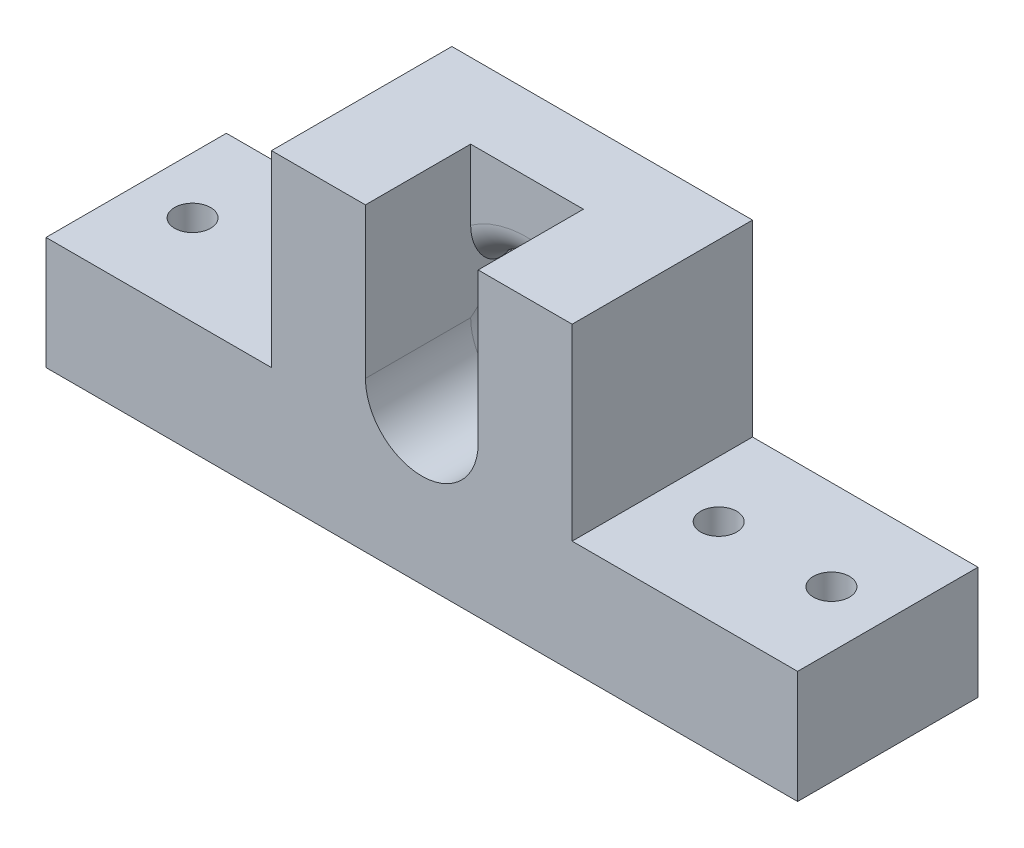
ISO-10303-21;
HEADER;
FILE_DESCRIPTION(('STEP AP214'),'2;1');
FILE_NAME('part.step','',(''),(''),'','','');
FILE_SCHEMA(('AUTOMOTIVE_DESIGN { 1 0 10303 214 1 1 1 1 }'));
ENDSEC;
DATA;
#1=APPLICATION_CONTEXT('core data for automotive mechanical design processes');
#2=APPLICATION_PROTOCOL_DEFINITION('international standard','automotive_design',2000,#1);
#3=PRODUCT_CONTEXT('',#1,'mechanical');
#4=PRODUCT('Part','Part','',(#3));
#5=PRODUCT_RELATED_PRODUCT_CATEGORY('part','',(#4));
#6=PRODUCT_DEFINITION_FORMATION('','',#4);
#7=PRODUCT_DEFINITION_CONTEXT('part definition',#1,'design');
#8=PRODUCT_DEFINITION('design','',#6,#7);
#9=PRODUCT_DEFINITION_SHAPE('','',#8);
#10=(LENGTH_UNIT() NAMED_UNIT(*) SI_UNIT(.MILLI.,.METRE.));
#11=(NAMED_UNIT(*) PLANE_ANGLE_UNIT() SI_UNIT($,.RADIAN.));
#12=(NAMED_UNIT(*) SI_UNIT($,.STERADIAN.) SOLID_ANGLE_UNIT());
#13=UNCERTAINTY_MEASURE_WITH_UNIT(LENGTH_MEASURE(1.E-05),#10,'distance_accuracy_value','');
#14=(GEOMETRIC_REPRESENTATION_CONTEXT(3) GLOBAL_UNCERTAINTY_ASSIGNED_CONTEXT((#13)) GLOBAL_UNIT_ASSIGNED_CONTEXT((#10,
#11,#12)) REPRESENTATION_CONTEXT('',''));
#15=CARTESIAN_POINT('',(0.,0.,0.));
#16=DIRECTION('',(0.,0.,1.));
#17=DIRECTION('',(1.,0.,0.));
#18=AXIS2_PLACEMENT_3D('',#15,#16,#17);
#19=CARTESIAN_POINT('',(0.,0.,3.));
#20=DIRECTION('',(0.,0.,-1.));
#21=DIRECTION('',(-1.,0.,0.));
#22=AXIS2_PLACEMENT_3D('',#19,#20,#21);
#23=TOROIDAL_SURFACE('',#22,6.51393202250021,2.);
#24=CARTESIAN_POINT('',(0.,0.,5.));
#25=DIRECTION('',(0.,0.,1.));
#26=DIRECTION('',(1.,0.,0.));
#27=AXIS2_PLACEMENT_3D('',#24,#25,#26);
#28=CIRCLE('',#27,6.51393202250021);
#29=CARTESIAN_POINT('',(-3.75,5.32623792124926,5.));
#30=VERTEX_POINT('',#29);
#31=CARTESIAN_POINT('',(3.75,5.32623792124926,5.));
#32=VERTEX_POINT('',#31);
#33=EDGE_CURVE('E248',#30,#32,#28,.F.);
#34=ORIENTED_EDGE('',*,*,#33,.F.);
#35=CARTESIAN_POINT('',(-3.75,5.32623792124926,5.));
#36=CARTESIAN_POINT('',(-3.75,5.24142075305049,4.99999589275912));
#37=CARTESIAN_POINT('',(-3.75,5.15665584859394,4.996393060593));
#38=CARTESIAN_POINT('',(-3.75,4.98774697404806,4.98232777876594));
#39=CARTESIAN_POINT('',(-3.75,4.90360264574141,4.97186966106574));
#40=CARTESIAN_POINT('',(-3.75,4.65274389859945,4.93071637865047));
#41=CARTESIAN_POINT('',(-3.75,4.48757234833523,4.89024203738008));
#42=CARTESIAN_POINT('',(-3.75,4.15320531995224,4.78184843346914));
#43=CARTESIAN_POINT('',(-3.75,3.98458646643673,4.71215196628134));
#44=CARTESIAN_POINT('',(-3.75,3.74139729987364,4.58868198549796));
#45=CARTESIAN_POINT('',(-3.75,3.66191812480479,4.54434275404163));
#46=CARTESIAN_POINT('',(-3.75,3.50682196432229,4.4493783283302));
#47=CARTESIAN_POINT('',(-3.75,3.43120357558848,4.39875544135044));
#48=CARTESIAN_POINT('',(-3.75,3.25997785602826,4.27305740879634));
#49=CARTESIAN_POINT('',(-3.75,3.16618499187349,4.19547948351475));
#50=CARTESIAN_POINT('',(-3.75,2.98997837199384,4.02832952085482));
#51=CARTESIAN_POINT('',(-3.75,2.90754430834929,3.93877946810826));
#52=CARTESIAN_POINT('',(-3.75,2.78260024439482,3.77663176413565));
#53=CARTESIAN_POINT('',(-3.75,2.73566181799742,3.70747366959804));
#54=CARTESIAN_POINT('',(-3.75,2.65267693131445,3.56286453836619));
#55=CARTESIAN_POINT('',(-3.75,2.61661134332685,3.48742485439183));
#56=CARTESIAN_POINT('',(-3.75,2.56505292043284,3.3473269582184));
#57=CARTESIAN_POINT('',(-3.75,2.54684324776595,3.28368282276986));
#58=CARTESIAN_POINT('',(-3.75,2.52139690051183,3.1542466754707));
#59=CARTESIAN_POINT('',(-3.75,2.51414683623527,3.0884573850243));
#60=CARTESIAN_POINT('',(-3.75,2.51147563157978,2.95645123111973));
#61=CARTESIAN_POINT('',(-3.75,2.51608675069872,2.89023369121582));
#62=CARTESIAN_POINT('',(-3.75,2.53661817693441,2.75960711691154));
#63=CARTESIAN_POINT('',(-3.75,2.55254407950708,2.69519899370393));
#64=CARTESIAN_POINT('',(-3.75,2.59993234790015,2.5517862186649));
#65=CARTESIAN_POINT('',(-3.75,2.63452237528982,2.47383046359681));
#66=CARTESIAN_POINT('',(-3.75,2.71573980506262,2.32403383978969));
#67=CARTESIAN_POINT('',(-3.75,2.76244442555167,2.25223628016114));
#68=CARTESIAN_POINT('',(-3.75,2.85436040261289,2.12885841605535));
#69=CARTESIAN_POINT('',(-3.75,2.89802160113365,2.07609704247627));
#70=CARTESIAN_POINT('',(-3.75,2.98981868429598,1.97452836625829));
#71=CARTESIAN_POINT('',(-3.75,3.03795983314878,1.92572584476509));
#72=CARTESIAN_POINT('',(-3.75,3.13676832766109,1.83293898188836));
#73=CARTESIAN_POINT('',(-3.75,3.18736163841635,1.78887513028478));
#74=CARTESIAN_POINT('',(-3.75,3.2912901974201,1.70441609670762));
#75=CARTESIAN_POINT('',(-3.75,3.34461723876659,1.66401083787398));
#76=CARTESIAN_POINT('',(-3.75,3.39911632203731,1.62530589386354));
#77=B_SPLINE_CURVE_WITH_KNOTS('',3,(#35,#36,#37,#38,#39,#40,#41,#42,#43,#44,#45,#46,#47,#48,#49,
#50,#51,#52,#53,#54,#55,#56,#57,#58,#59,#60,#61,#62,#63,#64,#65,#66,#67,#68,#69,#70,#71,#72,#73,
#74,#75,#76),.UNSPECIFIED.,.F.,.F.,(4,2,2,2,2,2,2,2,2,2,2,2,2,2,2,2,2,2,2,2,4),(0.,
0.254285952569605,0.50841137262712,1.01656918063696,1.56157292830256,1.83436241062647,
2.10705202292391,2.471309920665,2.834907884414,3.08495551445269,3.3345606540104,
3.53233526624986,3.72986805534574,3.92793865267557,4.12610726932957,4.38055044885354,
4.63665709693599,4.84183197365397,5.04725106308665,5.24836744503832,5.44891187748436),.UNSPECIFIED.);
#78=CARTESIAN_POINT('',(-3.75,3.34219083015094,1.66666666666666));
#79=VERTEX_POINT('',#78);
#80=EDGE_CURVE('E49',#30,#79,#77,.T.);
#81=ORIENTED_EDGE('',*,*,#80,.T.);
#82=CARTESIAN_POINT('',(0.,0.,1.66666666666667));
#83=DIRECTION('',(0.,0.,1.));
#84=DIRECTION('',(1.,0.,0.));
#85=AXIS2_PLACEMENT_3D('',#82,#83,#84);
#86=CIRCLE('',#85,5.02322003750035);
#87=CARTESIAN_POINT('',(2.89181328198696,4.107329483651,1.66666666666667));
#88=VERTEX_POINT('',#87);
#89=EDGE_CURVE('E60',#88,#79,#86,.T.);
#90=ORIENTED_EDGE('',*,*,#89,.F.);
#91=CARTESIAN_POINT('',(0.,0.,1.66666666666667));
#92=DIRECTION('',(0.,0.,1.));
#93=DIRECTION('',(1.,0.,0.));
#94=AXIS2_PLACEMENT_3D('',#91,#92,#93);
#95=CIRCLE('',#94,5.02322003750035);
#96=CARTESIAN_POINT('',(3.75,3.34219083015094,1.66666666666666));
#97=VERTEX_POINT('',#96);
#98=EDGE_CURVE('E276',#97,#88,#95,.T.);
#99=ORIENTED_EDGE('',*,*,#98,.F.);
#100=CARTESIAN_POINT('',(3.75,5.32623792124926,5.));
#101=CARTESIAN_POINT('',(3.75,5.24142075305049,4.99999589275912));
#102=CARTESIAN_POINT('',(3.75,5.15665584859394,4.996393060593));
#103=CARTESIAN_POINT('',(3.75,4.98774697404806,4.98232777876594));
#104=CARTESIAN_POINT('',(3.75,4.90360264574141,4.97186966106574));
#105=CARTESIAN_POINT('',(3.75,4.65274389859945,4.93071637865047));
#106=CARTESIAN_POINT('',(3.75,4.48757234833523,4.89024203738008));
#107=CARTESIAN_POINT('',(3.75,4.15320531995224,4.78184843346914));
#108=CARTESIAN_POINT('',(3.75,3.98458646643673,4.71215196628134));
#109=CARTESIAN_POINT('',(3.75,3.74139729987364,4.58868198549796));
#110=CARTESIAN_POINT('',(3.75,3.66191812480479,4.54434275404163));
#111=CARTESIAN_POINT('',(3.75,3.50682196432229,4.4493783283302));
#112=CARTESIAN_POINT('',(3.75,3.43120357558848,4.39875544135044));
#113=CARTESIAN_POINT('',(3.75,3.25997785602826,4.27305740879634));
#114=CARTESIAN_POINT('',(3.75,3.16618499187349,4.19547948351475));
#115=CARTESIAN_POINT('',(3.75,2.98997837199384,4.02832952085482));
#116=CARTESIAN_POINT('',(3.75,2.90754430834929,3.93877946810826));
#117=CARTESIAN_POINT('',(3.75,2.78260024439482,3.77663176413565));
#118=CARTESIAN_POINT('',(3.75,2.73566181799742,3.70747366959804));
#119=CARTESIAN_POINT('',(3.75,2.65267693131445,3.56286453836619));
#120=CARTESIAN_POINT('',(3.75,2.61661134332685,3.48742485439183));
#121=CARTESIAN_POINT('',(3.75,2.56505292043284,3.3473269582184));
#122=CARTESIAN_POINT('',(3.75,2.54684324776595,3.28368282276986));
#123=CARTESIAN_POINT('',(3.75,2.52139690051183,3.1542466754707));
#124=CARTESIAN_POINT('',(3.75,2.51414683623527,3.0884573850243));
#125=CARTESIAN_POINT('',(3.75,2.51147563157978,2.95645123111973));
#126=CARTESIAN_POINT('',(3.75,2.51608675069872,2.89023369121582));
#127=CARTESIAN_POINT('',(3.75,2.53661817693441,2.75960711691154));
#128=CARTESIAN_POINT('',(3.75,2.55254407950708,2.69519899370393));
#129=CARTESIAN_POINT('',(3.75,2.59993234790015,2.5517862186649));
#130=CARTESIAN_POINT('',(3.75,2.63452237528982,2.47383046359681));
#131=CARTESIAN_POINT('',(3.75,2.71573980506262,2.32403383978969));
#132=CARTESIAN_POINT('',(3.75,2.76244442555167,2.25223628016114));
#133=CARTESIAN_POINT('',(3.75,2.85436040261289,2.12885841605535));
#134=CARTESIAN_POINT('',(3.75,2.89802160113365,2.07609704247627));
#135=CARTESIAN_POINT('',(3.75,2.98981868429598,1.97452836625829));
#136=CARTESIAN_POINT('',(3.75,3.03795983314878,1.92572584476509));
#137=CARTESIAN_POINT('',(3.75,3.13676832766109,1.83293898188836));
#138=CARTESIAN_POINT('',(3.75,3.18736163841635,1.78887513028478));
#139=CARTESIAN_POINT('',(3.75,3.2912901974201,1.70441609670762));
#140=CARTESIAN_POINT('',(3.75,3.34461723876659,1.66401083787398));
#141=CARTESIAN_POINT('',(3.75,3.39911632203731,1.62530589386354));
#142=B_SPLINE_CURVE_WITH_KNOTS('',3,(#100,#101,#102,#103,#104,#105,#106,#107,#108,#109,#110,
#111,#112,#113,#114,#115,#116,#117,#118,#119,#120,#121,#122,#123,#124,#125,#126,#127,#128,#129,
#130,#131,#132,#133,#134,#135,#136,#137,#138,#139,#140,#141),.UNSPECIFIED.,.F.,.F.,(4,2,2,2,2,2,
2,2,2,2,2,2,2,2,2,2,2,2,2,2,4),(0.,0.254285952569605,0.50841137262712,1.01656918063696,
1.56157292830256,1.83436241062647,2.10705202292391,2.471309920665,2.834907884414,
3.08495551445269,3.3345606540104,3.53233526624986,3.72986805534574,3.92793865267557,
4.12610726932957,4.38055044885354,4.63665709693599,4.84183197365397,5.04725106308665,
5.24836744503832,5.44891187748436),.UNSPECIFIED.);
#143=EDGE_CURVE('E11',#97,#32,#142,.F.);
#144=ORIENTED_EDGE('',*,*,#143,.T.);
#145=EDGE_LOOP('',(#34,#81,#90,#99,#144));
#146=FACE_BOUND('',#145,.T.);
#147=ADVANCED_FACE('F36',(#146),#23,.T.);
#148=CARTESIAN_POINT('',(10.,-10.,12.));
#149=DIRECTION('',(-1.,0.,0.));
#150=DIRECTION('',(0.,0.,1.));
#151=AXIS2_PLACEMENT_3D('',#148,#149,#150);
#152=PLANE('',#151);
#153=DIRECTION('',(0.,0.,1.));
#154=VECTOR('',#153,1.);
#155=CARTESIAN_POINT('',(10.,-2.50000000000003,0.));
#156=LINE('',#155,#154);
#157=CARTESIAN_POINT('',(10.,-2.50000000000003,0.));
#158=VERTEX_POINT('',#157);
#159=CARTESIAN_POINT('',(10.,-2.50000000000003,12.));
#160=VERTEX_POINT('',#159);
#161=EDGE_CURVE('E191',#158,#160,#156,.T.);
#162=ORIENTED_EDGE('',*,*,#161,.F.);
#163=DIRECTION('',(0.,1.,0.));
#164=VECTOR('',#163,1.);
#165=CARTESIAN_POINT('',(10.,-10.,0.));
#166=LINE('',#165,#164);
#167=CARTESIAN_POINT('',(10.,10.,0.));
#168=VERTEX_POINT('',#167);
#169=EDGE_CURVE('E221',#158,#168,#166,.T.);
#170=ORIENTED_EDGE('',*,*,#169,.T.);
#171=DIRECTION('',(0.,0.,-1.));
#172=VECTOR('',#171,1.);
#173=CARTESIAN_POINT('',(10.,10.,12.));
#174=LINE('',#173,#172);
#175=CARTESIAN_POINT('',(10.,10.,12.));
#176=VERTEX_POINT('',#175);
#177=EDGE_CURVE('E239',#176,#168,#174,.T.);
#178=ORIENTED_EDGE('',*,*,#177,.F.);
#179=DIRECTION('',(0.,1.,0.));
#180=VECTOR('',#179,1.);
#181=CARTESIAN_POINT('',(10.,-10.,12.));
#182=LINE('',#181,#180);
#183=EDGE_CURVE('E222',#160,#176,#182,.T.);
#184=ORIENTED_EDGE('',*,*,#183,.F.);
#185=EDGE_LOOP('',(#162,#170,#178,#184));
#186=FACE_BOUND('',#185,.T.);
#187=ADVANCED_FACE('F312',(#186),#152,.F.);
#188=CARTESIAN_POINT('',(0.,0.,5.));
#189=DIRECTION('',(0.,0.,-1.));
#190=DIRECTION('',(-1.,0.,0.));
#191=AXIS2_PLACEMENT_3D('',#188,#189,#190);
#192=TOROIDAL_SURFACE('',#191,8.75,5.);
#193=CARTESIAN_POINT('',(0.,0.,0.));
#194=DIRECTION('',(0.,0.,-1.));
#195=DIRECTION('',(-1.,0.,0.));
#196=AXIS2_PLACEMENT_3D('',#193,#194,#195);
#197=CIRCLE('',#196,8.75);
#198=CARTESIAN_POINT('',(-8.75,0.,0.));
#199=VERTEX_POINT('',#198);
#200=EDGE_CURVE('E242',#199,#199,#197,.F.);
#201=ORIENTED_EDGE('',*,*,#200,.F.);
#202=EDGE_LOOP('',(#201));
#203=FACE_BOUND('',#202,.T.);
#204=ORIENTED_EDGE('',*,*,#89,.T.);
#205=CARTESIAN_POINT('',(-3.75,3.34219083015094,1.66666666666666));
#206=CARTESIAN_POINT('',(-3.75,3.18375045831794,1.78452059336337));
#207=CARTESIAN_POINT('',(-3.75,3.02852785496756,1.90657516122958));
#208=CARTESIAN_POINT('',(-3.75,2.72411204642601,2.15778019919901));
#209=CARTESIAN_POINT('',(-3.75,2.57491452549424,2.28692542801372));
#210=CARTESIAN_POINT('',(-3.75,2.1364308000886,2.68239162266341));
#211=CARTESIAN_POINT('',(-3.75,1.85516015486667,2.95757880115431));
#212=CARTESIAN_POINT('',(-3.75,1.30915338146643,3.52188548354713));
#213=CARTESIAN_POINT('',(-3.75,1.04436841247005,3.81095884920809));
#214=CARTESIAN_POINT('',(-3.75,0.522785560624921,4.39644353846854));
#215=CARTESIAN_POINT('',(-3.74999999999999,0.265992725728618,4.69285929559331));
#216=CARTESIAN_POINT('',(-3.75,0.00617213260276022,4.99287303469035));
#217=CARTESIAN_POINT('',(-3.75,0.00308606558016268,4.99643651793387));
#218=CARTESIAN_POINT('',(-3.75,0.,5.));
#219=B_SPLINE_CURVE_WITH_KNOTS('',3,(#205,#206,#207,#208,#209,#210,#211,#212,#213,#214,#215,
#216,#217,#218),.UNSPECIFIED.,.F.,.F.,(4,2,2,2,2,2,4),(0.,0.592215527133382,1.18399904329588,
2.36345221215954,3.53922619531928,4.71572833479174,4.72987047041556),.UNSPECIFIED.);
#220=CARTESIAN_POINT('',(-3.75,0.,5.));
#221=VERTEX_POINT('',#220);
#222=EDGE_CURVE('E425',#79,#221,#219,.T.);
#223=ORIENTED_EDGE('',*,*,#222,.T.);
#224=CARTESIAN_POINT('',(0.,0.,5.));
#225=DIRECTION('',(0.,0.,-1.));
#226=DIRECTION('',(-1.,0.,0.));
#227=AXIS2_PLACEMENT_3D('',#224,#225,#226);
#228=CIRCLE('',#227,3.75);
#229=CARTESIAN_POINT('',(3.75,0.,5.));
#230=VERTEX_POINT('',#229);
#231=EDGE_CURVE('E245',#230,#221,#228,.T.);
#232=ORIENTED_EDGE('',*,*,#231,.F.);
#233=CARTESIAN_POINT('',(3.75,3.34219083015094,1.66666666666666));
#234=CARTESIAN_POINT('',(3.75,3.18375045831794,1.78452059336337));
#235=CARTESIAN_POINT('',(3.75,3.02852785496756,1.90657516122958));
#236=CARTESIAN_POINT('',(3.75,2.72411204642601,2.15778019919901));
#237=CARTESIAN_POINT('',(3.75,2.57491452549424,2.28692542801372));
#238=CARTESIAN_POINT('',(3.75,2.1364308000886,2.68239162266341));
#239=CARTESIAN_POINT('',(3.75,1.85516015486667,2.95757880115431));
#240=CARTESIAN_POINT('',(3.75,1.30915338146643,3.52188548354713));
#241=CARTESIAN_POINT('',(3.75,1.04436841247005,3.81095884920809));
#242=CARTESIAN_POINT('',(3.75,0.522785560624921,4.39644353846854));
#243=CARTESIAN_POINT('',(3.74999999999999,0.265992725728618,4.69285929559331));
#244=CARTESIAN_POINT('',(3.75,0.00617213260276022,4.99287303469035));
#245=CARTESIAN_POINT('',(3.75,0.00308606558016268,4.99643651793387));
#246=CARTESIAN_POINT('',(3.75,0.,5.));
#247=B_SPLINE_CURVE_WITH_KNOTS('',3,(#233,#234,#235,#236,#237,#238,#239,#240,#241,#242,#243,
#244,#245,#246),.UNSPECIFIED.,.F.,.F.,(4,2,2,2,2,2,4),(0.,0.592215527133382,1.18399904329588,
2.36345221215954,3.53922619531928,4.71572833479174,4.72987047041556),.UNSPECIFIED.);
#248=EDGE_CURVE('E269',#230,#97,#247,.F.);
#249=ORIENTED_EDGE('',*,*,#248,.T.);
#250=ORIENTED_EDGE('',*,*,#98,.T.);
#251=EDGE_LOOP('',(#204,#223,#232,#249,#250));
#252=FACE_BOUND('',#251,.T.);
#253=ADVANCED_FACE('F278',(#203,#252),#192,.T.);
#254=CARTESIAN_POINT('',(0.,0.,12.));
#255=DIRECTION('',(0.,0.,-1.));
#256=DIRECTION('',(-1.,0.,0.));
#257=AXIS2_PLACEMENT_3D('',#254,#255,#256);
#258=PLANE('',#257);
#259=CARTESIAN_POINT('',(0.,0.,12.));
#260=DIRECTION('',(0.,0.,1.));
#261=DIRECTION('',(1.,0.,0.));
#262=AXIS2_PLACEMENT_3D('',#259,#260,#261);
#263=CIRCLE('',#262,3.75);
#264=CARTESIAN_POINT('',(-3.75,0.,12.));
#265=VERTEX_POINT('',#264);
#266=CARTESIAN_POINT('',(3.75,0.,12.));
#267=VERTEX_POINT('',#266);
#268=EDGE_CURVE('E212',#265,#267,#263,.T.);
#269=ORIENTED_EDGE('',*,*,#268,.F.);
#270=DIRECTION('',(0.,-1.,0.));
#271=VECTOR('',#270,1.);
#272=CARTESIAN_POINT('',(-3.75,0.,12.));
#273=LINE('',#272,#271);
#274=CARTESIAN_POINT('',(-3.75,10.,12.));
#275=VERTEX_POINT('',#274);
#276=EDGE_CURVE('E201',#275,#265,#273,.T.);
#277=ORIENTED_EDGE('',*,*,#276,.F.);
#278=DIRECTION('',(-1.,0.,0.));
#279=VECTOR('',#278,1.);
#280=CARTESIAN_POINT('',(-10.,10.,12.));
#281=LINE('',#280,#279);
#282=CARTESIAN_POINT('',(-10.,10.,12.));
#283=VERTEX_POINT('',#282);
#284=EDGE_CURVE('E224',#275,#283,#281,.T.);
#285=ORIENTED_EDGE('',*,*,#284,.T.);
#286=DIRECTION('',(0.,-1.,0.));
#287=VECTOR('',#286,1.);
#288=CARTESIAN_POINT('',(-10.,-10.,12.));
#289=LINE('',#288,#287);
#290=CARTESIAN_POINT('',(-10.,-2.50000000000004,12.));
#291=VERTEX_POINT('',#290);
#292=EDGE_CURVE('E155',#283,#291,#289,.T.);
#293=ORIENTED_EDGE('',*,*,#292,.T.);
#294=DIRECTION('',(-1.,0.,0.));
#295=VECTOR('',#294,1.);
#296=CARTESIAN_POINT('',(-25.,-2.50000000000004,12.));
#297=LINE('',#296,#295);
#298=CARTESIAN_POINT('',(-25.,-2.50000000000004,12.));
#299=VERTEX_POINT('',#298);
#300=EDGE_CURVE('E170',#291,#299,#297,.T.);
#301=ORIENTED_EDGE('',*,*,#300,.T.);
#302=DIRECTION('',(0.,-1.,0.));
#303=VECTOR('',#302,1.);
#304=CARTESIAN_POINT('',(-25.,-10.,12.));
#305=LINE('',#304,#303);
#306=CARTESIAN_POINT('',(-25.,-10.,12.));
#307=VERTEX_POINT('',#306);
#308=EDGE_CURVE('E160',#299,#307,#305,.T.);
#309=ORIENTED_EDGE('',*,*,#308,.T.);
#310=DIRECTION('',(1.,0.,0.));
#311=VECTOR('',#310,1.);
#312=CARTESIAN_POINT('',(-10.,-10.,12.));
#313=LINE('',#312,#311);
#314=CARTESIAN_POINT('',(25.0000000000001,-10.,12.));
#315=VERTEX_POINT('',#314);
#316=EDGE_CURVE('E143',#307,#315,#313,.T.);
#317=ORIENTED_EDGE('',*,*,#316,.T.);
#318=DIRECTION('',(0.,1.,0.));
#319=VECTOR('',#318,1.);
#320=CARTESIAN_POINT('',(25.0000000000001,-10.,12.));
#321=LINE('',#320,#319);
#322=CARTESIAN_POINT('',(25.,-2.50000000000003,12.));
#323=VERTEX_POINT('',#322);
#324=EDGE_CURVE('E173',#315,#323,#321,.T.);
#325=ORIENTED_EDGE('',*,*,#324,.T.);
#326=DIRECTION('',(-1.,0.,0.));
#327=VECTOR('',#326,1.);
#328=CARTESIAN_POINT('',(25.,-2.50000000000003,12.));
#329=LINE('',#328,#327);
#330=EDGE_CURVE('E185',#323,#160,#329,.T.);
#331=ORIENTED_EDGE('',*,*,#330,.T.);
#332=ORIENTED_EDGE('',*,*,#183,.T.);
#333=CARTESIAN_POINT('',(3.75,10.,12.));
#334=VERTEX_POINT('',#333);
#335=EDGE_CURVE('E226',#176,#334,#281,.T.);
#336=ORIENTED_EDGE('',*,*,#335,.T.);
#337=DIRECTION('',(0.,1.,0.));
#338=VECTOR('',#337,1.);
#339=CARTESIAN_POINT('',(3.75,0.,12.));
#340=LINE('',#339,#338);
#341=EDGE_CURVE('E194',#267,#334,#340,.T.);
#342=ORIENTED_EDGE('',*,*,#341,.F.);
#343=EDGE_LOOP('',(#269,#277,#285,#293,#301,#309,#317,#325,#331,#332,#336,#342));
#344=FACE_BOUND('',#343,.T.);
#345=ADVANCED_FACE('F168',(#344),#258,.F.);
#346=CARTESIAN_POINT('',(0.,0.,0.));
#347=DIRECTION('',(0.,0.,-1.));
#348=DIRECTION('',(-1.,0.,0.));
#349=AXIS2_PLACEMENT_3D('',#346,#347,#348);
#350=PLANE('',#349);
#351=ORIENTED_EDGE('',*,*,#200,.T.);
#352=EDGE_LOOP('',(#351));
#353=FACE_BOUND('',#352,.T.);
#354=ORIENTED_EDGE('',*,*,#169,.F.);
#355=DIRECTION('',(-1.,0.,0.));
#356=VECTOR('',#355,1.);
#357=CARTESIAN_POINT('',(25.,-2.50000000000003,0.));
#358=LINE('',#357,#356);
#359=CARTESIAN_POINT('',(25.,-2.50000000000003,0.));
#360=VERTEX_POINT('',#359);
#361=EDGE_CURVE('E184',#360,#158,#358,.T.);
#362=ORIENTED_EDGE('',*,*,#361,.F.);
#363=DIRECTION('',(0.,1.,0.));
#364=VECTOR('',#363,1.);
#365=CARTESIAN_POINT('',(25.0000000000001,-10.,0.));
#366=LINE('',#365,#364);
#367=CARTESIAN_POINT('',(25.0000000000001,-10.,0.));
#368=VERTEX_POINT('',#367);
#369=EDGE_CURVE('E181',#368,#360,#366,.T.);
#370=ORIENTED_EDGE('',*,*,#369,.F.);
#371=DIRECTION('',(1.,0.,0.));
#372=VECTOR('',#371,1.);
#373=CARTESIAN_POINT('',(-10.,-10.,0.));
#374=LINE('',#373,#372);
#375=CARTESIAN_POINT('',(-25.,-10.,0.));
#376=VERTEX_POINT('',#375);
#377=EDGE_CURVE('E225',#376,#368,#374,.T.);
#378=ORIENTED_EDGE('',*,*,#377,.F.);
#379=DIRECTION('',(0.,-1.,0.));
#380=VECTOR('',#379,1.);
#381=CARTESIAN_POINT('',(-25.,-10.,0.));
#382=LINE('',#381,#380);
#383=CARTESIAN_POINT('',(-25.,-2.50000000000004,0.));
#384=VERTEX_POINT('',#383);
#385=EDGE_CURVE('E163',#384,#376,#382,.T.);
#386=ORIENTED_EDGE('',*,*,#385,.F.);
#387=DIRECTION('',(-1.,0.,0.));
#388=VECTOR('',#387,1.);
#389=CARTESIAN_POINT('',(-25.,-2.50000000000004,0.));
#390=LINE('',#389,#388);
#391=CARTESIAN_POINT('',(-10.,-2.50000000000004,0.));
#392=VERTEX_POINT('',#391);
#393=EDGE_CURVE('E171',#392,#384,#390,.T.);
#394=ORIENTED_EDGE('',*,*,#393,.F.);
#395=DIRECTION('',(0.,-1.,0.));
#396=VECTOR('',#395,1.);
#397=CARTESIAN_POINT('',(-10.,-10.,0.));
#398=LINE('',#397,#396);
#399=CARTESIAN_POINT('',(-10.,10.,0.));
#400=VERTEX_POINT('',#399);
#401=EDGE_CURVE('E233',#400,#392,#398,.T.);
#402=ORIENTED_EDGE('',*,*,#401,.F.);
#403=DIRECTION('',(-1.,0.,0.));
#404=VECTOR('',#403,1.);
#405=CARTESIAN_POINT('',(-10.,10.,0.));
#406=LINE('',#405,#404);
#407=EDGE_CURVE('E231',#168,#400,#406,.T.);
#408=ORIENTED_EDGE('',*,*,#407,.F.);
#409=EDGE_LOOP('',(#354,#362,#370,#378,#386,#394,#402,#408));
#410=FACE_BOUND('',#409,.T.);
#411=ADVANCED_FACE('F298',(#353,#410),#350,.T.);
#412=CARTESIAN_POINT('',(-10.,10.,12.));
#413=DIRECTION('',(0.,-1.,0.));
#414=DIRECTION('',(0.,0.,-1.));
#415=AXIS2_PLACEMENT_3D('',#412,#413,#414);
#416=PLANE('',#415);
#417=ORIENTED_EDGE('',*,*,#284,.F.);
#418=DIRECTION('',(0.,0.,1.));
#419=VECTOR('',#418,1.);
#420=CARTESIAN_POINT('',(-3.75,10.,5.));
#421=LINE('',#420,#419);
#422=CARTESIAN_POINT('',(-3.75,10.,5.));
#423=VERTEX_POINT('',#422);
#424=EDGE_CURVE('E213',#423,#275,#421,.T.);
#425=ORIENTED_EDGE('',*,*,#424,.F.);
#426=DIRECTION('',(-1.,0.,0.));
#427=VECTOR('',#426,1.);
#428=CARTESIAN_POINT('',(-3.75,10.,5.));
#429=LINE('',#428,#427);
#430=CARTESIAN_POINT('',(3.75,10.,5.));
#431=VERTEX_POINT('',#430);
#432=EDGE_CURVE('E200',#431,#423,#429,.T.);
#433=ORIENTED_EDGE('',*,*,#432,.F.);
#434=DIRECTION('',(0.,0.,1.));
#435=VECTOR('',#434,1.);
#436=CARTESIAN_POINT('',(3.75,10.,5.));
#437=LINE('',#436,#435);
#438=EDGE_CURVE('E215',#431,#334,#437,.T.);
#439=ORIENTED_EDGE('',*,*,#438,.T.);
#440=ORIENTED_EDGE('',*,*,#335,.F.);
#441=ORIENTED_EDGE('',*,*,#177,.T.);
#442=ORIENTED_EDGE('',*,*,#407,.T.);
#443=DIRECTION('',(0.,0.,-1.));
#444=VECTOR('',#443,1.);
#445=CARTESIAN_POINT('',(-10.,10.,12.));
#446=LINE('',#445,#444);
#447=EDGE_CURVE('E154',#283,#400,#446,.T.);
#448=ORIENTED_EDGE('',*,*,#447,.F.);
#449=EDGE_LOOP('',(#417,#425,#433,#439,#440,#441,#442,#448));
#450=FACE_BOUND('',#449,.T.);
#451=ADVANCED_FACE('F301',(#450),#416,.F.);
#452=CARTESIAN_POINT('',(-10.,-10.,12.));
#453=DIRECTION('',(1.,0.,0.));
#454=DIRECTION('',(0.,0.,-1.));
#455=AXIS2_PLACEMENT_3D('',#452,#453,#454);
#456=PLANE('',#455);
#457=ORIENTED_EDGE('',*,*,#401,.T.);
#458=DIRECTION('',(0.,0.,1.));
#459=VECTOR('',#458,1.);
#460=CARTESIAN_POINT('',(-10.,-2.50000000000004,0.));
#461=LINE('',#460,#459);
#462=EDGE_CURVE('E179',#392,#291,#461,.T.);
#463=ORIENTED_EDGE('',*,*,#462,.T.);
#464=ORIENTED_EDGE('',*,*,#292,.F.);
#465=ORIENTED_EDGE('',*,*,#447,.T.);
#466=EDGE_LOOP('',(#457,#463,#464,#465));
#467=FACE_BOUND('',#466,.T.);
#468=ADVANCED_FACE('F305',(#467),#456,.F.);
#469=CARTESIAN_POINT('',(-10.,-10.,12.));
#470=DIRECTION('',(0.,1.,0.));
#471=DIRECTION('',(0.,0.,1.));
#472=AXIS2_PLACEMENT_3D('',#469,#470,#471);
#473=PLANE('',#472);
#474=CARTESIAN_POINT('',(-21.25,-10.,6.));
#475=DIRECTION('',(0.,-1.,0.));
#476=DIRECTION('',(0.,0.,-1.));
#477=AXIS2_PLACEMENT_3D('',#474,#475,#476);
#478=CIRCLE('',#477,2.2);
#479=CARTESIAN_POINT('',(-21.25,-10.,3.8));
#480=VERTEX_POINT('',#479);
#481=EDGE_CURVE('E365',#480,#480,#478,.T.);
#482=ORIENTED_EDGE('',*,*,#481,.F.);
#483=EDGE_LOOP('',(#482));
#484=FACE_BOUND('',#483,.T.);
#485=CARTESIAN_POINT('',(-13.75,-10.,6.));
#486=DIRECTION('',(0.,-1.,0.));
#487=DIRECTION('',(0.,0.,-1.));
#488=AXIS2_PLACEMENT_3D('',#485,#486,#487);
#489=CIRCLE('',#488,2.2);
#490=CARTESIAN_POINT('',(-13.75,-10.,3.8));
#491=VERTEX_POINT('',#490);
#492=EDGE_CURVE('E265',#491,#491,#489,.T.);
#493=ORIENTED_EDGE('',*,*,#492,.F.);
#494=EDGE_LOOP('',(#493));
#495=FACE_BOUND('',#494,.T.);
#496=CARTESIAN_POINT('',(13.75,-10.,6.));
#497=DIRECTION('',(0.,-1.,0.));
#498=DIRECTION('',(0.,0.,-1.));
#499=AXIS2_PLACEMENT_3D('',#496,#497,#498);
#500=CIRCLE('',#499,2.2);
#501=CARTESIAN_POINT('',(13.75,-10.,3.8));
#502=VERTEX_POINT('',#501);
#503=EDGE_CURVE('E260',#502,#502,#500,.T.);
#504=ORIENTED_EDGE('',*,*,#503,.F.);
#505=EDGE_LOOP('',(#504));
#506=FACE_BOUND('',#505,.T.);
#507=CARTESIAN_POINT('',(21.25,-10.,6.));
#508=DIRECTION('',(0.,-1.,0.));
#509=DIRECTION('',(0.,0.,-1.));
#510=AXIS2_PLACEMENT_3D('',#507,#508,#509);
#511=CIRCLE('',#510,2.2);
#512=CARTESIAN_POINT('',(21.25,-10.,3.8));
#513=VERTEX_POINT('',#512);
#514=EDGE_CURVE('E255',#513,#513,#511,.T.);
#515=ORIENTED_EDGE('',*,*,#514,.F.);
#516=EDGE_LOOP('',(#515));
#517=FACE_BOUND('',#516,.T.);
#518=ORIENTED_EDGE('',*,*,#377,.T.);
#519=DIRECTION('',(0.,0.,1.));
#520=VECTOR('',#519,1.);
#521=CARTESIAN_POINT('',(25.0000000000001,-10.,0.));
#522=LINE('',#521,#520);
#523=EDGE_CURVE('E149',#368,#315,#522,.T.);
#524=ORIENTED_EDGE('',*,*,#523,.T.);
#525=ORIENTED_EDGE('',*,*,#316,.F.);
#526=DIRECTION('',(0.,0.,1.));
#527=VECTOR('',#526,1.);
#528=CARTESIAN_POINT('',(-25.,-10.,0.));
#529=LINE('',#528,#527);
#530=EDGE_CURVE('E146',#376,#307,#529,.T.);
#531=ORIENTED_EDGE('',*,*,#530,.F.);
#532=EDGE_LOOP('',(#518,#524,#525,#531));
#533=FACE_BOUND('',#532,.T.);
#534=ADVANCED_FACE('F145',(#484,#495,#506,#517,#533),#473,.F.);
#535=CARTESIAN_POINT('',(0.,0.,12.));
#536=DIRECTION('',(0.,0.,-1.));
#537=DIRECTION('',(-1.,0.,0.));
#538=AXIS2_PLACEMENT_3D('',#535,#536,#537);
#539=CYLINDRICAL_SURFACE('',#538,3.75);
#540=DIRECTION('',(0.,0.,1.));
#541=VECTOR('',#540,1.);
#542=CARTESIAN_POINT('',(3.75,0.,5.));
#543=LINE('',#542,#541);
#544=EDGE_CURVE('E206',#230,#267,#543,.T.);
#545=ORIENTED_EDGE('',*,*,#544,.F.);
#546=ORIENTED_EDGE('',*,*,#231,.T.);
#547=DIRECTION('',(0.,0.,1.));
#548=VECTOR('',#547,1.);
#549=CARTESIAN_POINT('',(-3.75,0.,5.));
#550=LINE('',#549,#548);
#551=EDGE_CURVE('E209',#221,#265,#550,.T.);
#552=ORIENTED_EDGE('',*,*,#551,.T.);
#553=ORIENTED_EDGE('',*,*,#268,.T.);
#554=EDGE_LOOP('',(#545,#546,#552,#553));
#555=FACE_BOUND('',#554,.T.);
#556=ADVANCED_FACE('F291',(#555),#539,.F.);
#557=CARTESIAN_POINT('',(-3.75,0.,5.));
#558=DIRECTION('',(-1.,0.,0.));
#559=DIRECTION('',(0.,0.,1.));
#560=AXIS2_PLACEMENT_3D('',#557,#558,#559);
#561=PLANE('',#560);
#562=ORIENTED_EDGE('',*,*,#276,.T.);
#563=ORIENTED_EDGE('',*,*,#551,.F.);
#564=ORIENTED_EDGE('',*,*,#222,.F.);
#565=ORIENTED_EDGE('',*,*,#80,.F.);
#566=DIRECTION('',(0.,-1.,0.));
#567=VECTOR('',#566,1.);
#568=CARTESIAN_POINT('',(-3.75,0.,5.));
#569=LINE('',#568,#567);
#570=EDGE_CURVE('E203',#423,#30,#569,.T.);
#571=ORIENTED_EDGE('',*,*,#570,.F.);
#572=ORIENTED_EDGE('',*,*,#424,.T.);
#573=EDGE_LOOP('',(#562,#563,#564,#565,#571,#572));
#574=FACE_BOUND('',#573,.T.);
#575=ADVANCED_FACE('F287',(#574),#561,.F.);
#576=CARTESIAN_POINT('',(3.75,0.,5.));
#577=DIRECTION('',(1.,0.,0.));
#578=DIRECTION('',(0.,0.,-1.));
#579=AXIS2_PLACEMENT_3D('',#576,#577,#578);
#580=PLANE('',#579);
#581=ORIENTED_EDGE('',*,*,#341,.T.);
#582=ORIENTED_EDGE('',*,*,#438,.F.);
#583=DIRECTION('',(0.,1.,0.));
#584=VECTOR('',#583,1.);
#585=CARTESIAN_POINT('',(3.75,0.,5.));
#586=LINE('',#585,#584);
#587=EDGE_CURVE('E198',#32,#431,#586,.T.);
#588=ORIENTED_EDGE('',*,*,#587,.F.);
#589=ORIENTED_EDGE('',*,*,#143,.F.);
#590=ORIENTED_EDGE('',*,*,#248,.F.);
#591=ORIENTED_EDGE('',*,*,#544,.T.);
#592=EDGE_LOOP('',(#581,#582,#588,#589,#590,#591));
#593=FACE_BOUND('',#592,.T.);
#594=ADVANCED_FACE('F281',(#593),#580,.F.);
#595=CARTESIAN_POINT('',(0.,0.,5.));
#596=DIRECTION('',(0.,0.,1.));
#597=DIRECTION('',(1.,0.,0.));
#598=AXIS2_PLACEMENT_3D('',#595,#596,#597);
#599=PLANE('',#598);
#600=ORIENTED_EDGE('',*,*,#570,.T.);
#601=ORIENTED_EDGE('',*,*,#33,.T.);
#602=ORIENTED_EDGE('',*,*,#587,.T.);
#603=ORIENTED_EDGE('',*,*,#432,.T.);
#604=EDGE_LOOP('',(#600,#601,#602,#603));
#605=FACE_BOUND('',#604,.T.);
#606=ADVANCED_FACE('F286',(#605),#599,.T.);
#607=CARTESIAN_POINT('',(25.,-2.50000000000003,0.));
#608=DIRECTION('',(0.,1.,0.));
#609=DIRECTION('',(0.,0.,1.));
#610=AXIS2_PLACEMENT_3D('',#607,#608,#609);
#611=PLANE('',#610);
#612=CARTESIAN_POINT('',(13.75,-2.50000000000003,6.));
#613=DIRECTION('',(0.,1.,0.));
#614=DIRECTION('',(0.,0.,1.));
#615=AXIS2_PLACEMENT_3D('',#612,#613,#614);
#616=CIRCLE('',#615,1.2);
#617=CARTESIAN_POINT('',(13.75,-2.50000000000003,7.2));
#618=VERTEX_POINT('',#617);
#619=EDGE_CURVE('E252',#618,#618,#616,.T.);
#620=ORIENTED_EDGE('',*,*,#619,.F.);
#621=EDGE_LOOP('',(#620));
#622=FACE_BOUND('',#621,.T.);
#623=CARTESIAN_POINT('',(21.25,-2.50000000000003,6.));
#624=DIRECTION('',(0.,1.,0.));
#625=DIRECTION('',(0.,0.,1.));
#626=AXIS2_PLACEMENT_3D('',#623,#624,#625);
#627=CIRCLE('',#626,1.2);
#628=CARTESIAN_POINT('',(21.25,-2.50000000000003,7.2));
#629=VERTEX_POINT('',#628);
#630=EDGE_CURVE('E165',#629,#629,#627,.T.);
#631=ORIENTED_EDGE('',*,*,#630,.F.);
#632=EDGE_LOOP('',(#631));
#633=FACE_BOUND('',#632,.T.);
#634=ORIENTED_EDGE('',*,*,#330,.F.);
#635=DIRECTION('',(0.,0.,1.));
#636=VECTOR('',#635,1.);
#637=CARTESIAN_POINT('',(25.,-2.50000000000003,0.));
#638=LINE('',#637,#636);
#639=EDGE_CURVE('E195',#360,#323,#638,.T.);
#640=ORIENTED_EDGE('',*,*,#639,.F.);
#641=ORIENTED_EDGE('',*,*,#361,.T.);
#642=ORIENTED_EDGE('',*,*,#161,.T.);
#643=EDGE_LOOP('',(#634,#640,#641,#642));
#644=FACE_BOUND('',#643,.T.);
#645=ADVANCED_FACE('F329',(#622,#633,#644),#611,.T.);
#646=CARTESIAN_POINT('',(25.0000000000001,-10.,0.));
#647=DIRECTION('',(1.,0.,0.));
#648=DIRECTION('',(0.,1.,0.));
#649=AXIS2_PLACEMENT_3D('',#646,#647,#648);
#650=PLANE('',#649);
#651=ORIENTED_EDGE('',*,*,#324,.F.);
#652=ORIENTED_EDGE('',*,*,#523,.F.);
#653=ORIENTED_EDGE('',*,*,#369,.T.);
#654=ORIENTED_EDGE('',*,*,#639,.T.);
#655=EDGE_LOOP('',(#651,#652,#653,#654));
#656=FACE_BOUND('',#655,.T.);
#657=ADVANCED_FACE('F331',(#656),#650,.T.);
#658=CARTESIAN_POINT('',(-25.,-10.,0.));
#659=DIRECTION('',(-1.,0.,0.));
#660=DIRECTION('',(0.,0.,1.));
#661=AXIS2_PLACEMENT_3D('',#658,#659,#660);
#662=PLANE('',#661);
#663=ORIENTED_EDGE('',*,*,#308,.F.);
#664=DIRECTION('',(0.,0.,1.));
#665=VECTOR('',#664,1.);
#666=CARTESIAN_POINT('',(-25.,-2.50000000000004,0.));
#667=LINE('',#666,#665);
#668=EDGE_CURVE('E164',#384,#299,#667,.T.);
#669=ORIENTED_EDGE('',*,*,#668,.F.);
#670=ORIENTED_EDGE('',*,*,#385,.T.);
#671=ORIENTED_EDGE('',*,*,#530,.T.);
#672=EDGE_LOOP('',(#663,#669,#670,#671));
#673=FACE_BOUND('',#672,.T.);
#674=ADVANCED_FACE('F159',(#673),#662,.T.);
#675=CARTESIAN_POINT('',(-25.,-2.50000000000004,0.));
#676=DIRECTION('',(0.,1.,0.));
#677=DIRECTION('',(-1.,0.,0.));
#678=AXIS2_PLACEMENT_3D('',#675,#676,#677);
#679=PLANE('',#678);
#680=CARTESIAN_POINT('',(-21.25,-2.50000000000004,6.));
#681=DIRECTION('',(0.,1.,0.));
#682=DIRECTION('',(-1.,0.,0.));
#683=AXIS2_PLACEMENT_3D('',#680,#681,#682);
#684=CIRCLE('',#683,1.2);
#685=CARTESIAN_POINT('',(-22.45,-2.50000000000004,6.));
#686=VERTEX_POINT('',#685);
#687=EDGE_CURVE('E262',#686,#686,#684,.T.);
#688=ORIENTED_EDGE('',*,*,#687,.F.);
#689=EDGE_LOOP('',(#688));
#690=FACE_BOUND('',#689,.T.);
#691=CARTESIAN_POINT('',(-13.75,-2.50000000000004,6.));
#692=DIRECTION('',(0.,1.,0.));
#693=DIRECTION('',(-1.,0.,0.));
#694=AXIS2_PLACEMENT_3D('',#691,#692,#693);
#695=CIRCLE('',#694,1.2);
#696=CARTESIAN_POINT('',(-14.95,-2.50000000000004,6.));
#697=VERTEX_POINT('',#696);
#698=EDGE_CURVE('E257',#697,#697,#695,.T.);
#699=ORIENTED_EDGE('',*,*,#698,.F.);
#700=EDGE_LOOP('',(#699));
#701=FACE_BOUND('',#700,.T.);
#702=ORIENTED_EDGE('',*,*,#300,.F.);
#703=ORIENTED_EDGE('',*,*,#462,.F.);
#704=ORIENTED_EDGE('',*,*,#393,.T.);
#705=ORIENTED_EDGE('',*,*,#668,.T.);
#706=EDGE_LOOP('',(#702,#703,#704,#705));
#707=FACE_BOUND('',#706,.T.);
#708=ADVANCED_FACE('F334',(#690,#701,#707),#679,.T.);
#709=CARTESIAN_POINT('',(21.25,-10.,6.));
#710=DIRECTION('',(0.,-1.,0.));
#711=DIRECTION('',(0.,0.,-1.));
#712=AXIS2_PLACEMENT_3D('',#709,#710,#711);
#713=CYLINDRICAL_SURFACE('',#712,1.2);
#714=ORIENTED_EDGE('',*,*,#630,.T.);
#715=EDGE_LOOP('',(#714));
#716=FACE_BOUND('',#715,.T.);
#717=CARTESIAN_POINT('',(21.25,-8.,6.));
#718=DIRECTION('',(0.,-1.,0.));
#719=DIRECTION('',(0.,0.,-1.));
#720=AXIS2_PLACEMENT_3D('',#717,#718,#719);
#721=CIRCLE('',#720,1.2);
#722=CARTESIAN_POINT('',(21.25,-8.,4.8));
#723=VERTEX_POINT('',#722);
#724=EDGE_CURVE('E251',#723,#723,#721,.T.);
#725=ORIENTED_EDGE('',*,*,#724,.T.);
#726=EDGE_LOOP('',(#725));
#727=FACE_BOUND('',#726,.T.);
#728=ADVANCED_FACE('F390',(#716,#727),#713,.F.);
#729=CARTESIAN_POINT('',(22.45,-8.,6.));
#730=DIRECTION('',(0.,1.,0.));
#731=DIRECTION('',(0.,0.,1.));
#732=AXIS2_PLACEMENT_3D('',#729,#730,#731);
#733=PLANE('',#732);
#734=ORIENTED_EDGE('',*,*,#724,.F.);
#735=EDGE_LOOP('',(#734));
#736=FACE_BOUND('',#735,.T.);
#737=CARTESIAN_POINT('',(21.25,-8.,6.));
#738=DIRECTION('',(0.,-1.,0.));
#739=DIRECTION('',(0.,0.,-1.));
#740=AXIS2_PLACEMENT_3D('',#737,#738,#739);
#741=CIRCLE('',#740,2.2);
#742=CARTESIAN_POINT('',(21.25,-8.,3.8));
#743=VERTEX_POINT('',#742);
#744=EDGE_CURVE('E341',#743,#743,#741,.T.);
#745=ORIENTED_EDGE('',*,*,#744,.T.);
#746=EDGE_LOOP('',(#745));
#747=FACE_BOUND('',#746,.T.);
#748=ADVANCED_FACE('F380',(#736,#747),#733,.F.);
#749=CARTESIAN_POINT('',(21.25,-10.,6.));
#750=DIRECTION('',(0.,-1.,0.));
#751=DIRECTION('',(0.,0.,-1.));
#752=AXIS2_PLACEMENT_3D('',#749,#750,#751);
#753=CYLINDRICAL_SURFACE('',#752,2.2);
#754=ORIENTED_EDGE('',*,*,#744,.F.);
#755=EDGE_LOOP('',(#754));
#756=FACE_BOUND('',#755,.T.);
#757=ORIENTED_EDGE('',*,*,#514,.T.);
#758=EDGE_LOOP('',(#757));
#759=FACE_BOUND('',#758,.T.);
#760=ADVANCED_FACE('F377',(#756,#759),#753,.F.);
#761=CARTESIAN_POINT('',(13.75,-10.,6.));
#762=DIRECTION('',(0.,-1.,0.));
#763=DIRECTION('',(0.,0.,-1.));
#764=AXIS2_PLACEMENT_3D('',#761,#762,#763);
#765=CYLINDRICAL_SURFACE('',#764,1.2);
#766=ORIENTED_EDGE('',*,*,#619,.T.);
#767=EDGE_LOOP('',(#766));
#768=FACE_BOUND('',#767,.T.);
#769=CARTESIAN_POINT('',(13.75,-8.,6.));
#770=DIRECTION('',(0.,-1.,0.));
#771=DIRECTION('',(0.,0.,-1.));
#772=AXIS2_PLACEMENT_3D('',#769,#770,#771);
#773=CIRCLE('',#772,1.2);
#774=CARTESIAN_POINT('',(13.75,-8.,4.8));
#775=VERTEX_POINT('',#774);
#776=EDGE_CURVE('E256',#775,#775,#773,.T.);
#777=ORIENTED_EDGE('',*,*,#776,.T.);
#778=EDGE_LOOP('',(#777));
#779=FACE_BOUND('',#778,.T.);
#780=ADVANCED_FACE('F379',(#768,#779),#765,.F.);
#781=CARTESIAN_POINT('',(14.95,-8.,6.));
#782=DIRECTION('',(0.,1.,0.));
#783=DIRECTION('',(0.,0.,1.));
#784=AXIS2_PLACEMENT_3D('',#781,#782,#783);
#785=PLANE('',#784);
#786=ORIENTED_EDGE('',*,*,#776,.F.);
#787=EDGE_LOOP('',(#786));
#788=FACE_BOUND('',#787,.T.);
#789=CARTESIAN_POINT('',(13.75,-8.,6.));
#790=DIRECTION('',(0.,-1.,0.));
#791=DIRECTION('',(0.,0.,-1.));
#792=AXIS2_PLACEMENT_3D('',#789,#790,#791);
#793=CIRCLE('',#792,2.2);
#794=CARTESIAN_POINT('',(13.75,-8.,3.8));
#795=VERTEX_POINT('',#794);
#796=EDGE_CURVE('E348',#795,#795,#793,.T.);
#797=ORIENTED_EDGE('',*,*,#796,.T.);
#798=EDGE_LOOP('',(#797));
#799=FACE_BOUND('',#798,.T.);
#800=ADVANCED_FACE('F387',(#788,#799),#785,.F.);
#801=CARTESIAN_POINT('',(13.75,-10.,6.));
#802=DIRECTION('',(0.,-1.,0.));
#803=DIRECTION('',(0.,0.,-1.));
#804=AXIS2_PLACEMENT_3D('',#801,#802,#803);
#805=CYLINDRICAL_SURFACE('',#804,2.2);
#806=ORIENTED_EDGE('',*,*,#796,.F.);
#807=EDGE_LOOP('',(#806));
#808=FACE_BOUND('',#807,.T.);
#809=ORIENTED_EDGE('',*,*,#503,.T.);
#810=EDGE_LOOP('',(#809));
#811=FACE_BOUND('',#810,.T.);
#812=ADVANCED_FACE('F572',(#808,#811),#805,.F.);
#813=CARTESIAN_POINT('',(-13.75,-10.,6.));
#814=DIRECTION('',(0.,-1.,0.));
#815=DIRECTION('',(0.,0.,-1.));
#816=AXIS2_PLACEMENT_3D('',#813,#814,#815);
#817=CYLINDRICAL_SURFACE('',#816,1.2);
#818=ORIENTED_EDGE('',*,*,#698,.T.);
#819=EDGE_LOOP('',(#818));
#820=FACE_BOUND('',#819,.T.);
#821=CARTESIAN_POINT('',(-13.75,-8.,6.));
#822=DIRECTION('',(0.,-1.,0.));
#823=DIRECTION('',(0.,0.,-1.));
#824=AXIS2_PLACEMENT_3D('',#821,#822,#823);
#825=CIRCLE('',#824,1.2);
#826=CARTESIAN_POINT('',(-13.75,-8.,4.8));
#827=VERTEX_POINT('',#826);
#828=EDGE_CURVE('E261',#827,#827,#825,.T.);
#829=ORIENTED_EDGE('',*,*,#828,.T.);
#830=EDGE_LOOP('',(#829));
#831=FACE_BOUND('',#830,.T.);
#832=ADVANCED_FACE('F582',(#820,#831),#817,.F.);
#833=CARTESIAN_POINT('',(-12.55,-8.,6.));
#834=DIRECTION('',(0.,1.,0.));
#835=DIRECTION('',(0.,0.,1.));
#836=AXIS2_PLACEMENT_3D('',#833,#834,#835);
#837=PLANE('',#836);
#838=ORIENTED_EDGE('',*,*,#828,.F.);
#839=EDGE_LOOP('',(#838));
#840=FACE_BOUND('',#839,.T.);
#841=CARTESIAN_POINT('',(-13.75,-8.,6.));
#842=DIRECTION('',(0.,-1.,0.));
#843=DIRECTION('',(0.,0.,-1.));
#844=AXIS2_PLACEMENT_3D('',#841,#842,#843);
#845=CIRCLE('',#844,2.2);
#846=CARTESIAN_POINT('',(-13.75,-8.,3.8));
#847=VERTEX_POINT('',#846);
#848=EDGE_CURVE('E355',#847,#847,#845,.T.);
#849=ORIENTED_EDGE('',*,*,#848,.T.);
#850=EDGE_LOOP('',(#849));
#851=FACE_BOUND('',#850,.T.);
#852=ADVANCED_FACE('F593',(#840,#851),#837,.F.);
#853=CARTESIAN_POINT('',(-13.75,-10.,6.));
#854=DIRECTION('',(0.,-1.,0.));
#855=DIRECTION('',(0.,0.,-1.));
#856=AXIS2_PLACEMENT_3D('',#853,#854,#855);
#857=CYLINDRICAL_SURFACE('',#856,2.2);
#858=ORIENTED_EDGE('',*,*,#848,.F.);
#859=EDGE_LOOP('',(#858));
#860=FACE_BOUND('',#859,.T.);
#861=ORIENTED_EDGE('',*,*,#492,.T.);
#862=EDGE_LOOP('',(#861));
#863=FACE_BOUND('',#862,.T.);
#864=ADVANCED_FACE('F604',(#860,#863),#857,.F.);
#865=CARTESIAN_POINT('',(-21.25,-10.,6.));
#866=DIRECTION('',(0.,-1.,0.));
#867=DIRECTION('',(0.,0.,-1.));
#868=AXIS2_PLACEMENT_3D('',#865,#866,#867);
#869=CYLINDRICAL_SURFACE('',#868,1.2);
#870=ORIENTED_EDGE('',*,*,#687,.T.);
#871=EDGE_LOOP('',(#870));
#872=FACE_BOUND('',#871,.T.);
#873=CARTESIAN_POINT('',(-21.25,-8.,6.));
#874=DIRECTION('',(0.,-1.,0.));
#875=DIRECTION('',(0.,0.,-1.));
#876=AXIS2_PLACEMENT_3D('',#873,#874,#875);
#877=CIRCLE('',#876,1.2);
#878=CARTESIAN_POINT('',(-21.25,-8.,4.8));
#879=VERTEX_POINT('',#878);
#880=EDGE_CURVE('E266',#879,#879,#877,.T.);
#881=ORIENTED_EDGE('',*,*,#880,.T.);
#882=EDGE_LOOP('',(#881));
#883=FACE_BOUND('',#882,.T.);
#884=ADVANCED_FACE('F615',(#872,#883),#869,.F.);
#885=CARTESIAN_POINT('',(-20.05,-8.,6.));
#886=DIRECTION('',(0.,1.,0.));
#887=DIRECTION('',(0.,0.,1.));
#888=AXIS2_PLACEMENT_3D('',#885,#886,#887);
#889=PLANE('',#888);
#890=ORIENTED_EDGE('',*,*,#880,.F.);
#891=EDGE_LOOP('',(#890));
#892=FACE_BOUND('',#891,.T.);
#893=CARTESIAN_POINT('',(-21.25,-8.,6.));
#894=DIRECTION('',(0.,-1.,0.));
#895=DIRECTION('',(0.,0.,-1.));
#896=AXIS2_PLACEMENT_3D('',#893,#894,#895);
#897=CIRCLE('',#896,2.2);
#898=CARTESIAN_POINT('',(-21.25,-8.,3.8));
#899=VERTEX_POINT('',#898);
#900=EDGE_CURVE('E362',#899,#899,#897,.T.);
#901=ORIENTED_EDGE('',*,*,#900,.T.);
#902=EDGE_LOOP('',(#901));
#903=FACE_BOUND('',#902,.T.);
#904=ADVANCED_FACE('F626',(#892,#903),#889,.F.);
#905=CARTESIAN_POINT('',(-21.25,-10.,6.));
#906=DIRECTION('',(0.,-1.,0.));
#907=DIRECTION('',(0.,0.,-1.));
#908=AXIS2_PLACEMENT_3D('',#905,#906,#907);
#909=CYLINDRICAL_SURFACE('',#908,2.2);
#910=ORIENTED_EDGE('',*,*,#900,.F.);
#911=EDGE_LOOP('',(#910));
#912=FACE_BOUND('',#911,.T.);
#913=ORIENTED_EDGE('',*,*,#481,.T.);
#914=EDGE_LOOP('',(#913));
#915=FACE_BOUND('',#914,.T.);
#916=ADVANCED_FACE('F369',(#912,#915),#909,.F.);
#917=CLOSED_SHELL('',(#147,#187,#253,#345,#411,#451,#468,#534,#556,#575,#594,#606,#645,#657,
#674,#708,#728,#748,#760,#780,#800,#812,#832,#852,#864,#884,#904,#916));
#918=MANIFOLD_SOLID_BREP('B2',#917);
#919=ADVANCED_BREP_SHAPE_REPRESENTATION('',(#18,#918),#14);
#920=SHAPE_DEFINITION_REPRESENTATION(#9,#919);
ENDSEC;
END-ISO-10303-21;
